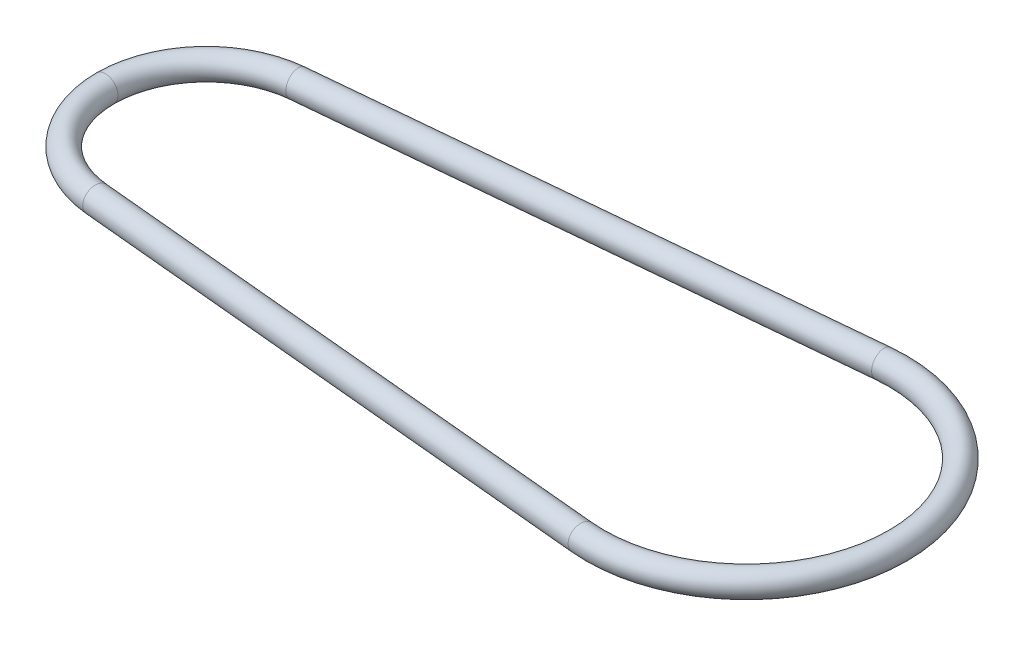
ISO-10303-21;
HEADER;
FILE_DESCRIPTION(('STEP AP214'),'2;1');
FILE_NAME('part.step','',(''),(''),'','','');
FILE_SCHEMA(('AUTOMOTIVE_DESIGN { 1 0 10303 214 1 1 1 1 }'));
ENDSEC;
DATA;
#1=APPLICATION_CONTEXT('core data for automotive mechanical design processes');
#2=APPLICATION_PROTOCOL_DEFINITION('international standard','automotive_design',2000,#1);
#3=PRODUCT_CONTEXT('',#1,'mechanical');
#4=PRODUCT('Part','Part','',(#3));
#5=PRODUCT_RELATED_PRODUCT_CATEGORY('part','',(#4));
#6=PRODUCT_DEFINITION_FORMATION('','',#4);
#7=PRODUCT_DEFINITION_CONTEXT('part definition',#1,'design');
#8=PRODUCT_DEFINITION('design','',#6,#7);
#9=PRODUCT_DEFINITION_SHAPE('','',#8);
#10=(LENGTH_UNIT() NAMED_UNIT(*) SI_UNIT(.MILLI.,.METRE.));
#11=(NAMED_UNIT(*) PLANE_ANGLE_UNIT() SI_UNIT($,.RADIAN.));
#12=(NAMED_UNIT(*) SI_UNIT($,.STERADIAN.) SOLID_ANGLE_UNIT());
#13=UNCERTAINTY_MEASURE_WITH_UNIT(LENGTH_MEASURE(1.E-05),#10,'distance_accuracy_value','');
#14=(GEOMETRIC_REPRESENTATION_CONTEXT(3) GLOBAL_UNCERTAINTY_ASSIGNED_CONTEXT((#13)) GLOBAL_UNIT_ASSIGNED_CONTEXT((#10,
#11,#12)) REPRESENTATION_CONTEXT('',''));
#15=CARTESIAN_POINT('',(0.,0.,0.));
#16=DIRECTION('',(0.,0.,1.));
#17=DIRECTION('',(1.,0.,0.));
#18=AXIS2_PLACEMENT_3D('',#15,#16,#17);
#19=CARTESIAN_POINT('',(0.,0.,0.));
#20=DIRECTION('',(0.,-1.,0.));
#21=DIRECTION('',(0.,0.,-1.));
#22=AXIS2_PLACEMENT_3D('',#19,#20,#21);
#23=TOROIDAL_SURFACE('',#22,25.4,3.175);
#24=CARTESIAN_POINT('',(-25.4,0.,0.));
#25=DIRECTION('',(0.,0.,1.));
#26=DIRECTION('',(1.,0.,0.));
#27=AXIS2_PLACEMENT_3D('',#24,#25,#26);
#28=CIRCLE('',#27,3.175);
#29=CARTESIAN_POINT('',(-28.575,0.,0.));
#30=VERTEX_POINT('',#29);
#31=EDGE_CURVE('E51',#30,#30,#28,.T.);
#32=CARTESIAN_POINT('',(-2.36961184732466,0.,-25.2892257630205));
#33=DIRECTION('',(-0.995638809567735,0.,0.0932918050127817));
#34=DIRECTION('',(0.0932918050127817,0.,0.995638809567735));
#35=AXIS2_PLACEMENT_3D('',#32,#33,#34);
#36=CIRCLE('',#35,3.175);
#37=CARTESIAN_POINT('',(-2.66581332824024,0.,-28.450378983398));
#38=VERTEX_POINT('',#37);
#39=EDGE_CURVE('E46',#38,#38,#36,.T.);
#40=CARTESIAN_POINT('',(0.,0.,0.));
#41=DIRECTION('',(0.,-1.,0.));
#42=DIRECTION('',(0.,0.,-1.));
#43=AXIS2_PLACEMENT_3D('',#40,#41,#42);
#44=CIRCLE('',#43,28.575);
#45=EDGE_CURVE('',#30,#38,#44,.T.);
#46=ORIENTED_EDGE('',*,*,#31,.F.);
#47=ORIENTED_EDGE('',*,*,#39,.T.);
#48=ORIENTED_EDGE('',*,*,#45,.T.);
#49=ORIENTED_EDGE('',*,*,#45,.F.);
#50=EDGE_LOOP('',(#46,#48,#47,#49));
#51=FACE_BOUND('',#50,.T.);
#52=ADVANCED_FACE('F31',(#51),#23,.T.);
#53=CARTESIAN_POINT('',(-2.36961184732466,0.,-25.2892257630205));
#54=DIRECTION('',(0.995638809567735,0.,-0.0932918050127817));
#55=DIRECTION('',(-0.0932918050127817,0.,-0.995638809567735));
#56=AXIS2_PLACEMENT_3D('',#53,#54,#55);
#57=CYLINDRICAL_SURFACE('',#56,3.175);
#58=CARTESIAN_POINT('',(132.577582229013,0.,-37.9338386445307));
#59=DIRECTION('',(-0.995638809567735,0.,0.0932918050127819));
#60=DIRECTION('',(0.0932918050127819,0.,0.995638809567735));
#61=AXIS2_PLACEMENT_3D('',#58,#59,#60);
#62=CIRCLE('',#61,3.175);
#63=CARTESIAN_POINT('',(132.281380748097,0.,-41.0949918649083));
#64=VERTEX_POINT('',#63);
#65=EDGE_CURVE('E42',#64,#64,#62,.T.);
#66=ORIENTED_EDGE('',*,*,#65,.T.);
#67=EDGE_LOOP('',(#66));
#68=FACE_BOUND('',#67,.T.);
#69=ORIENTED_EDGE('',*,*,#39,.F.);
#70=EDGE_LOOP('',(#69));
#71=FACE_BOUND('',#70,.T.);
#72=ADVANCED_FACE('F58',(#68,#71),#57,.T.);
#73=CARTESIAN_POINT('',(136.132,0.,0.));
#74=DIRECTION('',(0.,-1.,0.));
#75=DIRECTION('',(0.,0.,-1.));
#76=AXIS2_PLACEMENT_3D('',#73,#74,#75);
#77=TOROIDAL_SURFACE('',#76,38.1,3.175);
#78=CARTESIAN_POINT('',(132.577582229013,0.,37.9338386445307));
#79=DIRECTION('',(0.995638809567735,0.,0.093291805012782));
#80=DIRECTION('',(0.093291805012782,0.,-0.995638809567735));
#81=AXIS2_PLACEMENT_3D('',#78,#79,#80);
#82=CIRCLE('',#81,3.175);
#83=CARTESIAN_POINT('',(132.281380748097,0.,41.0949918649083));
#84=VERTEX_POINT('',#83);
#85=EDGE_CURVE('E38',#84,#84,#82,.T.);
#86=CARTESIAN_POINT('',(136.132,0.,0.));
#87=DIRECTION('',(0.,-1.,0.));
#88=DIRECTION('',(0.,0.,-1.));
#89=AXIS2_PLACEMENT_3D('',#86,#87,#88);
#90=CIRCLE('',#89,41.275);
#91=EDGE_CURVE('',#64,#84,#90,.T.);
#92=ORIENTED_EDGE('',*,*,#65,.F.);
#93=ORIENTED_EDGE('',*,*,#85,.T.);
#94=ORIENTED_EDGE('',*,*,#91,.T.);
#95=ORIENTED_EDGE('',*,*,#91,.F.);
#96=EDGE_LOOP('',(#92,#94,#93,#95));
#97=FACE_BOUND('',#96,.T.);
#98=ADVANCED_FACE('F64',(#97),#77,.T.);
#99=CARTESIAN_POINT('',(132.577582229013,0.,37.9338386445307));
#100=DIRECTION('',(-0.995638809567735,0.,-0.0932918050127817));
#101=DIRECTION('',(-0.0932918050127817,0.,0.995638809567735));
#102=AXIS2_PLACEMENT_3D('',#99,#100,#101);
#103=CYLINDRICAL_SURFACE('',#102,3.175);
#104=CARTESIAN_POINT('',(-2.36961184732465,0.,25.2892257630205));
#105=DIRECTION('',(0.995638809567735,0.,0.0932918050127816));
#106=DIRECTION('',(0.0932918050127816,0.,-0.995638809567735));
#107=AXIS2_PLACEMENT_3D('',#104,#105,#106);
#108=CIRCLE('',#107,3.175);
#109=CARTESIAN_POINT('',(-2.66581332824026,0.,28.450378983398));
#110=VERTEX_POINT('',#109);
#111=EDGE_CURVE('E10',#110,#110,#108,.T.);
#112=CARTESIAN_POINT('',(-2.66581332824026,0.,28.450378983398));
#113=CARTESIAN_POINT('',(-1.26011338994507,0.,28.5820937009138));
#114=CARTESIAN_POINT('',(0.145586548350109,0.,28.7138084184295));
#115=CARTESIAN_POINT('',(2.95698642494048,0.,28.977237853461));
#116=CARTESIAN_POINT('',(4.36268636323568,0.,29.1089525709767));
#117=CARTESIAN_POINT('',(7.17408623982605,0.,29.3723820060081));
#118=CARTESIAN_POINT('',(8.57978617812124,0.,29.5040967235239));
#119=CARTESIAN_POINT('',(11.3911860547116,0.,29.7675261585553));
#120=CARTESIAN_POINT('',(12.7968859930068,0.,29.8992408760711));
#121=CARTESIAN_POINT('',(15.6082858695972,0.,30.1626703111025));
#122=CARTESIAN_POINT('',(17.0139858078923,0.,30.2943850286183));
#123=CARTESIAN_POINT('',(19.8253856844827,0.,30.5578144636497));
#124=CARTESIAN_POINT('',(21.2310856227779,0.,30.6895291811655));
#125=CARTESIAN_POINT('',(24.0424854993683,0.,30.9529586161969));
#126=CARTESIAN_POINT('',(25.4481854376634,0.,31.0846733337127));
#127=CARTESIAN_POINT('',(28.2595853142538,0.,31.3481027687441));
#128=CARTESIAN_POINT('',(29.665285252549,0.,31.4798174862599));
#129=CARTESIAN_POINT('',(32.4766851291394,0.,31.7432469212913));
#130=CARTESIAN_POINT('',(33.8823850674346,0.,31.8749616388071));
#131=CARTESIAN_POINT('',(36.6937849440249,0.,32.1383910738385));
#132=CARTESIAN_POINT('',(38.0994848823201,0.,32.2701057913542));
#133=CARTESIAN_POINT('',(40.9108847589105,0.,32.5335352263857));
#134=CARTESIAN_POINT('',(42.3165846972057,0.,32.6652499439014));
#135=CARTESIAN_POINT('',(45.127984573796,0.,32.9286793789329));
#136=CARTESIAN_POINT('',(46.5336845120912,0.,33.0603940964486));
#137=CARTESIAN_POINT('',(49.3450843886816,0.,33.3238235314801));
#138=CARTESIAN_POINT('',(50.7507843269768,0.,33.4555382489958));
#139=CARTESIAN_POINT('',(53.5621842035671,0.,33.7189676840273));
#140=CARTESIAN_POINT('',(54.9678841418623,0.,33.850682401543));
#141=CARTESIAN_POINT('',(57.7792840184527,0.,34.1141118365745));
#142=CARTESIAN_POINT('',(59.1849839567479,0.,34.2458265540902));
#143=CARTESIAN_POINT('',(61.9963838333382,0.,34.5092559891217));
#144=CARTESIAN_POINT('',(63.4020837716334,0.,34.6409707066374));
#145=CARTESIAN_POINT('',(66.2134836482238,0.,34.9044001416689));
#146=CARTESIAN_POINT('',(67.619183586519,0.,35.0361148591846));
#147=CARTESIAN_POINT('',(70.4305834631093,0.,35.2995442942161));
#148=CARTESIAN_POINT('',(71.8362834014045,0.,35.4312590117318));
#149=CARTESIAN_POINT('',(74.6476832779949,0.,35.6946884467633));
#150=CARTESIAN_POINT('',(76.0533832162901,0.,35.826403164279));
#151=CARTESIAN_POINT('',(78.8647830928805,0.,36.0898325993105));
#152=CARTESIAN_POINT('',(80.2704830311756,0.,36.2215473168262));
#153=CARTESIAN_POINT('',(83.081882907766,0.,36.4849767518577));
#154=CARTESIAN_POINT('',(84.4875828460612,0.,36.6166914693734));
#155=CARTESIAN_POINT('',(87.2989827226515,0.,36.8801209044049));
#156=CARTESIAN_POINT('',(88.7046826609467,0.,37.0118356219206));
#157=CARTESIAN_POINT('',(91.5160825375371,0.,37.2752650569521));
#158=CARTESIAN_POINT('',(92.9217824758323,0.,37.4069797744678));
#159=CARTESIAN_POINT('',(95.7331823524227,0.,37.6704092094992));
#160=CARTESIAN_POINT('',(97.1388822907178,0.,37.802123927015));
#161=CARTESIAN_POINT('',(99.9502821673082,0.,38.0655533620464));
#162=CARTESIAN_POINT('',(101.355982105603,0.,38.1972680795622));
#163=CARTESIAN_POINT('',(104.167381982194,0.,38.4606975145936));
#164=CARTESIAN_POINT('',(105.573081920489,0.,38.5924122321094));
#165=CARTESIAN_POINT('',(108.384481797079,0.,38.8558416671408));
#166=CARTESIAN_POINT('',(109.790181735375,0.,38.9875563846566));
#167=CARTESIAN_POINT('',(112.601581611965,0.,39.250985819688));
#168=CARTESIAN_POINT('',(114.00728155026,0.,39.3827005372038));
#169=CARTESIAN_POINT('',(116.81868142685,0.,39.6461299722352));
#170=CARTESIAN_POINT('',(118.224381365146,0.,39.777844689751));
#171=CARTESIAN_POINT('',(121.035781241736,0.,40.0412741247824));
#172=CARTESIAN_POINT('',(122.441481180031,0.,40.1729888422981));
#173=CARTESIAN_POINT('',(125.252881056622,0.,40.4364182773296));
#174=CARTESIAN_POINT('',(126.658580994917,0.,40.5681329948453));
#175=CARTESIAN_POINT('',(129.469980871507,0.,40.8315624298768));
#176=CARTESIAN_POINT('',(130.875680809802,0.,40.9632771473925));
#177=CARTESIAN_POINT('',(132.281380748097,0.,41.0949918649083));
#178=B_SPLINE_CURVE_WITH_KNOTS('',3,(#112,#113,#114,#115,#116,#117,#118,#119,#120,#121,#122,
#123,#124,#125,#126,#127,#128,#129,#130,#131,#132,#133,#134,#135,#136,#137,#138,#139,#140,#141,
#142,#143,#144,#145,#146,#147,#148,#149,#150,#151,#152,#153,#154,#155,#156,#157,#158,#159,#160,
#161,#162,#163,#164,#165,#166,#167,#168,#169,#170,#171,#172,#173,#174,#175,#176,#177),
.UNSPECIFIED.,.F.,.F.,(4,2,2,2,2,2,2,2,2,2,2,2,2,2,2,2,2,2,2,2,2,2,2,2,2,2,2,2,2,2,2,2,4),(0.,
4.23557195075234,8.47114390150471,12.706715852257,16.9422878030094,21.1778597537617,
25.4134317045141,29.6490036552664,33.8845756060188,38.1201475567711,42.3557195075234,
46.5912914582758,50.8268634090281,55.0624353597805,59.2980073105328,63.5335792612851,
67.7691512120375,72.0047231627898,76.2402951135422,80.4758670642945,84.7114390150469,
88.9470109657992,93.1825829165516,97.4181548673039,101.653726818056,105.889298768809,
110.124870719561,114.360442670313,118.596014621066,122.831586571818,127.06715852257,
131.302730473323,135.538302424075),.UNSPECIFIED.);
#179=EDGE_CURVE('BSEAM69',#110,#84,#178,.T.);
#180=ORIENTED_EDGE('',*,*,#111,.T.);
#181=ORIENTED_EDGE('',*,*,#85,.F.);
#182=ORIENTED_EDGE('',*,*,#179,.T.);
#183=ORIENTED_EDGE('',*,*,#179,.F.);
#184=EDGE_LOOP('',(#180,#182,#181,#183));
#185=FACE_BOUND('',#184,.T.);
#186=ADVANCED_FACE('F69',(#185),#103,.T.);
#187=CARTESIAN_POINT('',(0.,0.,0.));
#188=DIRECTION('',(0.,-1.,0.));
#189=DIRECTION('',(0.,0.,-1.));
#190=AXIS2_PLACEMENT_3D('',#187,#188,#189);
#191=TOROIDAL_SURFACE('',#190,25.4,3.175);
#192=CARTESIAN_POINT('',(0.,0.,0.));
#193=DIRECTION('',(0.,-1.,0.));
#194=DIRECTION('',(0.,0.,-1.));
#195=AXIS2_PLACEMENT_3D('',#192,#193,#194);
#196=CIRCLE('',#195,28.575);
#197=EDGE_CURVE('',#110,#30,#196,.T.);
#198=ORIENTED_EDGE('',*,*,#111,.F.);
#199=ORIENTED_EDGE('',*,*,#31,.T.);
#200=ORIENTED_EDGE('',*,*,#197,.T.);
#201=ORIENTED_EDGE('',*,*,#197,.F.);
#202=EDGE_LOOP('',(#198,#200,#199,#201));
#203=FACE_BOUND('',#202,.T.);
#204=ADVANCED_FACE('F33',(#203),#191,.T.);
#205=CLOSED_SHELL('',(#52,#72,#98,#186,#204));
#206=MANIFOLD_SOLID_BREP('B2',#205);
#207=ADVANCED_BREP_SHAPE_REPRESENTATION('',(#18,#206),#14);
#208=SHAPE_DEFINITION_REPRESENTATION(#9,#207);
ENDSEC;
END-ISO-10303-21;
